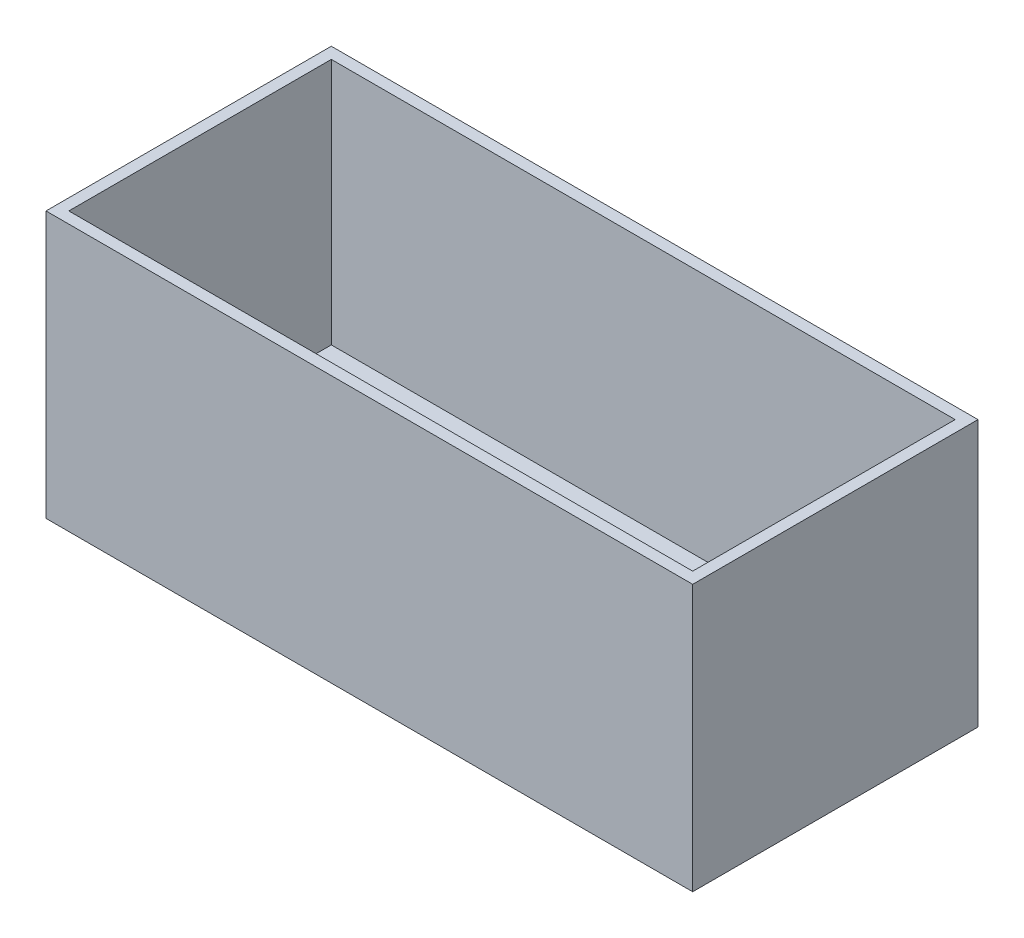
ISO-10303-21;
HEADER;
FILE_DESCRIPTION(('STEP AP214'),'2;1');
FILE_NAME('part.step','',(''),(''),'','','');
FILE_SCHEMA(('AUTOMOTIVE_DESIGN { 1 0 10303 214 1 1 1 1 }'));
ENDSEC;
DATA;
#1=APPLICATION_CONTEXT('core data for automotive mechanical design processes');
#2=APPLICATION_PROTOCOL_DEFINITION('international standard','automotive_design',2000,#1);
#3=PRODUCT_CONTEXT('',#1,'mechanical');
#4=PRODUCT('Part','Part','',(#3));
#5=PRODUCT_RELATED_PRODUCT_CATEGORY('part','',(#4));
#6=PRODUCT_DEFINITION_FORMATION('','',#4);
#7=PRODUCT_DEFINITION_CONTEXT('part definition',#1,'design');
#8=PRODUCT_DEFINITION('design','',#6,#7);
#9=PRODUCT_DEFINITION_SHAPE('','',#8);
#10=(LENGTH_UNIT() NAMED_UNIT(*) SI_UNIT(.MILLI.,.METRE.));
#11=(NAMED_UNIT(*) PLANE_ANGLE_UNIT() SI_UNIT($,.RADIAN.));
#12=(NAMED_UNIT(*) SI_UNIT($,.STERADIAN.) SOLID_ANGLE_UNIT());
#13=UNCERTAINTY_MEASURE_WITH_UNIT(LENGTH_MEASURE(1.E-05),#10,'distance_accuracy_value','');
#14=(GEOMETRIC_REPRESENTATION_CONTEXT(3) GLOBAL_UNCERTAINTY_ASSIGNED_CONTEXT((#13)) GLOBAL_UNIT_ASSIGNED_CONTEXT((#10,
#11,#12)) REPRESENTATION_CONTEXT('',''));
#15=CARTESIAN_POINT('',(0.,0.,0.));
#16=DIRECTION('',(0.,0.,1.));
#17=DIRECTION('',(1.,0.,0.));
#18=AXIS2_PLACEMENT_3D('',#15,#16,#17);
#19=CARTESIAN_POINT('',(0.,0.,0.));
#20=DIRECTION('',(0.,1.,0.));
#21=DIRECTION('',(0.,0.,1.));
#22=AXIS2_PLACEMENT_3D('',#19,#20,#21);
#23=PLANE('',#22);
#24=CARTESIAN_POINT('',(67.65,0.,-14.9000000000001));
#25=DIRECTION('',(0.,-1.,0.));
#26=DIRECTION('',(0.,0.,-1.));
#27=AXIS2_PLACEMENT_3D('',#24,#25,#26);
#28=CIRCLE('',#27,2.2);
#29=CARTESIAN_POINT('',(67.65,0.,-17.1000000000001));
#30=VERTEX_POINT('',#29);
#31=EDGE_CURVE('E319',#30,#30,#28,.T.);
#32=ORIENTED_EDGE('',*,*,#31,.F.);
#33=EDGE_LOOP('',(#32));
#34=FACE_BOUND('',#33,.T.);
#35=CARTESIAN_POINT('',(67.65,0.,27.9));
#36=DIRECTION('',(0.,1.,0.));
#37=DIRECTION('',(0.,0.,1.));
#38=AXIS2_PLACEMENT_3D('',#35,#36,#37);
#39=CIRCLE('',#38,2.2);
#40=CARTESIAN_POINT('',(67.65,0.,30.1));
#41=VERTEX_POINT('',#40);
#42=EDGE_CURVE('E320',#41,#41,#39,.T.);
#43=ORIENTED_EDGE('',*,*,#42,.T.);
#44=EDGE_LOOP('',(#43));
#45=FACE_BOUND('',#44,.T.);
#46=CARTESIAN_POINT('',(-67.65,0.,-14.9000000000001));
#47=DIRECTION('',(0.,1.,0.));
#48=DIRECTION('',(0.,0.,1.));
#49=AXIS2_PLACEMENT_3D('',#46,#47,#48);
#50=CIRCLE('',#49,2.2);
#51=CARTESIAN_POINT('',(-67.65,0.,-12.7000000000001));
#52=VERTEX_POINT('',#51);
#53=EDGE_CURVE('E168',#52,#52,#50,.T.);
#54=ORIENTED_EDGE('',*,*,#53,.T.);
#55=EDGE_LOOP('',(#54));
#56=FACE_BOUND('',#55,.T.);
#57=DIRECTION('',(0.,0.,1.));
#58=VECTOR('',#57,1.);
#59=CARTESIAN_POINT('',(-85.,0.,-37.5));
#60=LINE('',#59,#58);
#61=CARTESIAN_POINT('',(-85.,0.,-37.5));
#62=VERTEX_POINT('',#61);
#63=CARTESIAN_POINT('',(-85.,0.,37.5));
#64=VERTEX_POINT('',#63);
#65=EDGE_CURVE('E210',#62,#64,#60,.T.);
#66=ORIENTED_EDGE('',*,*,#65,.F.);
#67=DIRECTION('',(1.,0.,0.));
#68=VECTOR('',#67,1.);
#69=CARTESIAN_POINT('',(-85.,0.,-37.5));
#70=LINE('',#69,#68);
#71=CARTESIAN_POINT('',(85.,0.,-37.5));
#72=VERTEX_POINT('',#71);
#73=EDGE_CURVE('E217',#62,#72,#70,.T.);
#74=ORIENTED_EDGE('',*,*,#73,.T.);
#75=DIRECTION('',(0.,0.,1.));
#76=VECTOR('',#75,1.);
#77=CARTESIAN_POINT('',(85.,0.,-37.5));
#78=LINE('',#77,#76);
#79=CARTESIAN_POINT('',(85.,0.,37.5));
#80=VERTEX_POINT('',#79);
#81=EDGE_CURVE('E212',#72,#80,#78,.T.);
#82=ORIENTED_EDGE('',*,*,#81,.T.);
#83=DIRECTION('',(1.,0.,0.));
#84=VECTOR('',#83,1.);
#85=CARTESIAN_POINT('',(-85.,0.,37.5));
#86=LINE('',#85,#84);
#87=EDGE_CURVE('E209',#64,#80,#86,.T.);
#88=ORIENTED_EDGE('',*,*,#87,.F.);
#89=EDGE_LOOP('',(#66,#74,#82,#88));
#90=FACE_BOUND('',#89,.T.);
#91=CARTESIAN_POINT('',(-67.65,0.,27.8999999999999));
#92=DIRECTION('',(0.,-1.,0.));
#93=DIRECTION('',(0.,0.,-1.));
#94=AXIS2_PLACEMENT_3D('',#91,#92,#93);
#95=CIRCLE('',#94,2.2);
#96=CARTESIAN_POINT('',(-67.65,0.,25.6999999999999));
#97=VERTEX_POINT('',#96);
#98=EDGE_CURVE('E322',#97,#97,#95,.T.);
#99=ORIENTED_EDGE('',*,*,#98,.F.);
#100=EDGE_LOOP('',(#99));
#101=FACE_BOUND('',#100,.T.);
#102=ADVANCED_FACE('F69',(#34,#45,#56,#90,#101),#23,.F.);
#103=CARTESIAN_POINT('',(0.,5.,0.));
#104=DIRECTION('',(0.,1.,0.));
#105=DIRECTION('',(0.,0.,1.));
#106=AXIS2_PLACEMENT_3D('',#103,#104,#105);
#107=PLANE('',#106);
#108=CARTESIAN_POINT('',(67.65,5.,27.9));
#109=DIRECTION('',(0.,1.,0.));
#110=DIRECTION('',(0.,0.,1.));
#111=AXIS2_PLACEMENT_3D('',#108,#109,#110);
#112=CIRCLE('',#111,2.2);
#113=CARTESIAN_POINT('',(67.65,5.,30.1));
#114=VERTEX_POINT('',#113);
#115=EDGE_CURVE('E231',#114,#114,#112,.F.);
#116=ORIENTED_EDGE('',*,*,#115,.T.);
#117=EDGE_LOOP('',(#116));
#118=FACE_BOUND('',#117,.T.);
#119=CARTESIAN_POINT('',(-67.65,5.,-14.9000000000001));
#120=DIRECTION('',(0.,1.,0.));
#121=DIRECTION('',(0.,0.,1.));
#122=AXIS2_PLACEMENT_3D('',#119,#120,#121);
#123=CIRCLE('',#122,2.2);
#124=CARTESIAN_POINT('',(-67.65,5.,-12.7000000000001));
#125=VERTEX_POINT('',#124);
#126=EDGE_CURVE('E226',#125,#125,#123,.F.);
#127=ORIENTED_EDGE('',*,*,#126,.T.);
#128=EDGE_LOOP('',(#127));
#129=FACE_BOUND('',#128,.T.);
#130=DIRECTION('',(0.,0.,-1.));
#131=VECTOR('',#130,1.);
#132=CARTESIAN_POINT('',(82.,5.,0.));
#133=LINE('',#132,#131);
#134=CARTESIAN_POINT('',(82.,5.,34.5));
#135=VERTEX_POINT('',#134);
#136=CARTESIAN_POINT('',(82.,5.,-34.5));
#137=VERTEX_POINT('',#136);
#138=EDGE_CURVE('E170',#135,#137,#133,.T.);
#139=ORIENTED_EDGE('',*,*,#138,.T.);
#140=DIRECTION('',(-1.,0.,0.));
#141=VECTOR('',#140,1.);
#142=CARTESIAN_POINT('',(0.,5.,-34.5));
#143=LINE('',#142,#141);
#144=CARTESIAN_POINT('',(-82.,5.,-34.5));
#145=VERTEX_POINT('',#144);
#146=EDGE_CURVE('E87',#137,#145,#143,.T.);
#147=ORIENTED_EDGE('',*,*,#146,.T.);
#148=DIRECTION('',(0.,0.,-1.));
#149=VECTOR('',#148,1.);
#150=CARTESIAN_POINT('',(-82.,5.,0.));
#151=LINE('',#150,#149);
#152=CARTESIAN_POINT('',(-82.,5.,34.5));
#153=VERTEX_POINT('',#152);
#154=EDGE_CURVE('E154',#153,#145,#151,.T.);
#155=ORIENTED_EDGE('',*,*,#154,.F.);
#156=DIRECTION('',(-1.,0.,0.));
#157=VECTOR('',#156,1.);
#158=CARTESIAN_POINT('',(0.,5.,34.5));
#159=LINE('',#158,#157);
#160=EDGE_CURVE('E162',#135,#153,#159,.T.);
#161=ORIENTED_EDGE('',*,*,#160,.F.);
#162=EDGE_LOOP('',(#139,#147,#155,#161));
#163=FACE_BOUND('',#162,.T.);
#164=CARTESIAN_POINT('',(67.65,5.,-14.9000000000001));
#165=DIRECTION('',(0.,1.,0.));
#166=DIRECTION('',(0.,0.,1.));
#167=AXIS2_PLACEMENT_3D('',#164,#165,#166);
#168=CIRCLE('',#167,2.2);
#169=CARTESIAN_POINT('',(67.65,5.,-12.7000000000001));
#170=VERTEX_POINT('',#169);
#171=EDGE_CURVE('E237',#170,#170,#168,.T.);
#172=ORIENTED_EDGE('',*,*,#171,.F.);
#173=EDGE_LOOP('',(#172));
#174=FACE_BOUND('',#173,.T.);
#175=CARTESIAN_POINT('',(-67.65,5.,27.8999999999999));
#176=DIRECTION('',(0.,1.,0.));
#177=DIRECTION('',(0.,0.,1.));
#178=AXIS2_PLACEMENT_3D('',#175,#176,#177);
#179=CIRCLE('',#178,2.2);
#180=CARTESIAN_POINT('',(-67.65,5.,30.0999999999999));
#181=VERTEX_POINT('',#180);
#182=EDGE_CURVE('E71',#181,#181,#179,.T.);
#183=ORIENTED_EDGE('',*,*,#182,.F.);
#184=EDGE_LOOP('',(#183));
#185=FACE_BOUND('',#184,.T.);
#186=ADVANCED_FACE('F246',(#118,#129,#163,#174,#185),#107,.T.);
#187=CARTESIAN_POINT('',(-85.,5.,-37.5));
#188=DIRECTION('',(1.,0.,0.));
#189=DIRECTION('',(0.,0.,-1.));
#190=AXIS2_PLACEMENT_3D('',#187,#188,#189);
#191=PLANE('',#190);
#192=ORIENTED_EDGE('',*,*,#65,.T.);
#193=DIRECTION('',(0.,-1.,0.));
#194=VECTOR('',#193,1.);
#195=CARTESIAN_POINT('',(-85.,5.,37.5));
#196=LINE('',#195,#194);
#197=CARTESIAN_POINT('',(-85.,70.,37.5));
#198=VERTEX_POINT('',#197);
#199=EDGE_CURVE('E12',#198,#64,#196,.T.);
#200=ORIENTED_EDGE('',*,*,#199,.F.);
#201=DIRECTION('',(0.,0.,-1.));
#202=VECTOR('',#201,1.);
#203=CARTESIAN_POINT('',(-85.,70.,0.));
#204=LINE('',#203,#202);
#205=CARTESIAN_POINT('',(-85.,70.,-37.5));
#206=VERTEX_POINT('',#205);
#207=EDGE_CURVE('E189',#198,#206,#204,.T.);
#208=ORIENTED_EDGE('',*,*,#207,.T.);
#209=DIRECTION('',(0.,-1.,0.));
#210=VECTOR('',#209,1.);
#211=CARTESIAN_POINT('',(-85.,5.,-37.5));
#212=LINE('',#211,#210);
#213=EDGE_CURVE('E92',#206,#62,#212,.T.);
#214=ORIENTED_EDGE('',*,*,#213,.T.);
#215=EDGE_LOOP('',(#192,#200,#208,#214));
#216=FACE_BOUND('',#215,.T.);
#217=ADVANCED_FACE('F72',(#216),#191,.F.);
#218=CARTESIAN_POINT('',(-85.,5.,37.5));
#219=DIRECTION('',(0.,0.,-1.));
#220=DIRECTION('',(-1.,0.,0.));
#221=AXIS2_PLACEMENT_3D('',#218,#219,#220);
#222=PLANE('',#221);
#223=ORIENTED_EDGE('',*,*,#87,.T.);
#224=DIRECTION('',(0.,-1.,0.));
#225=VECTOR('',#224,1.);
#226=CARTESIAN_POINT('',(85.,5.,37.5));
#227=LINE('',#226,#225);
#228=CARTESIAN_POINT('',(85.,70.,37.5));
#229=VERTEX_POINT('',#228);
#230=EDGE_CURVE('E76',#229,#80,#227,.T.);
#231=ORIENTED_EDGE('',*,*,#230,.F.);
#232=DIRECTION('',(-1.,0.,0.));
#233=VECTOR('',#232,1.);
#234=CARTESIAN_POINT('',(0.,70.,37.5));
#235=LINE('',#234,#233);
#236=EDGE_CURVE('E201',#229,#198,#235,.T.);
#237=ORIENTED_EDGE('',*,*,#236,.T.);
#238=ORIENTED_EDGE('',*,*,#199,.T.);
#239=EDGE_LOOP('',(#223,#231,#237,#238));
#240=FACE_BOUND('',#239,.T.);
#241=ADVANCED_FACE('F260',(#240),#222,.F.);
#242=CARTESIAN_POINT('',(85.,5.,-37.5));
#243=DIRECTION('',(1.,0.,0.));
#244=DIRECTION('',(0.,0.,-1.));
#245=AXIS2_PLACEMENT_3D('',#242,#243,#244);
#246=PLANE('',#245);
#247=ORIENTED_EDGE('',*,*,#81,.F.);
#248=DIRECTION('',(0.,-1.,0.));
#249=VECTOR('',#248,1.);
#250=CARTESIAN_POINT('',(85.,5.,-37.5));
#251=LINE('',#250,#249);
#252=CARTESIAN_POINT('',(85.,70.,-37.5));
#253=VERTEX_POINT('',#252);
#254=EDGE_CURVE('E221',#253,#72,#251,.T.);
#255=ORIENTED_EDGE('',*,*,#254,.F.);
#256=DIRECTION('',(0.,0.,-1.));
#257=VECTOR('',#256,1.);
#258=CARTESIAN_POINT('',(85.,70.,0.));
#259=LINE('',#258,#257);
#260=EDGE_CURVE('E200',#229,#253,#259,.T.);
#261=ORIENTED_EDGE('',*,*,#260,.F.);
#262=ORIENTED_EDGE('',*,*,#230,.T.);
#263=EDGE_LOOP('',(#247,#255,#261,#262));
#264=FACE_BOUND('',#263,.T.);
#265=ADVANCED_FACE('F270',(#264),#246,.T.);
#266=CARTESIAN_POINT('',(-85.,5.,-37.5));
#267=DIRECTION('',(0.,0.,-1.));
#268=DIRECTION('',(-1.,0.,0.));
#269=AXIS2_PLACEMENT_3D('',#266,#267,#268);
#270=PLANE('',#269);
#271=ORIENTED_EDGE('',*,*,#73,.F.);
#272=ORIENTED_EDGE('',*,*,#213,.F.);
#273=DIRECTION('',(-1.,0.,0.));
#274=VECTOR('',#273,1.);
#275=CARTESIAN_POINT('',(0.,70.,-37.5));
#276=LINE('',#275,#274);
#277=EDGE_CURVE('E192',#253,#206,#276,.T.);
#278=ORIENTED_EDGE('',*,*,#277,.F.);
#279=ORIENTED_EDGE('',*,*,#254,.T.);
#280=EDGE_LOOP('',(#271,#272,#278,#279));
#281=FACE_BOUND('',#280,.T.);
#282=ADVANCED_FACE('F262',(#281),#270,.T.);
#283=CARTESIAN_POINT('',(0.,70.,0.));
#284=DIRECTION('',(0.,1.,0.));
#285=DIRECTION('',(0.,0.,1.));
#286=AXIS2_PLACEMENT_3D('',#283,#284,#285);
#287=PLANE('',#286);
#288=DIRECTION('',(0.,0.,-1.));
#289=VECTOR('',#288,1.);
#290=CARTESIAN_POINT('',(-82.,70.,0.));
#291=LINE('',#290,#289);
#292=CARTESIAN_POINT('',(-82.,70.,34.5));
#293=VERTEX_POINT('',#292);
#294=CARTESIAN_POINT('',(-82.,70.,-34.5));
#295=VERTEX_POINT('',#294);
#296=EDGE_CURVE('E146',#293,#295,#291,.T.);
#297=ORIENTED_EDGE('',*,*,#296,.T.);
#298=DIRECTION('',(-1.,0.,0.));
#299=VECTOR('',#298,1.);
#300=CARTESIAN_POINT('',(0.,70.,-34.5));
#301=LINE('',#300,#299);
#302=CARTESIAN_POINT('',(82.,70.,-34.5));
#303=VERTEX_POINT('',#302);
#304=EDGE_CURVE('E140',#303,#295,#301,.T.);
#305=ORIENTED_EDGE('',*,*,#304,.F.);
#306=DIRECTION('',(0.,0.,-1.));
#307=VECTOR('',#306,1.);
#308=CARTESIAN_POINT('',(82.,70.,0.));
#309=LINE('',#308,#307);
#310=CARTESIAN_POINT('',(82.,70.,34.5));
#311=VERTEX_POINT('',#310);
#312=EDGE_CURVE('E150',#311,#303,#309,.T.);
#313=ORIENTED_EDGE('',*,*,#312,.F.);
#314=DIRECTION('',(-1.,0.,0.));
#315=VECTOR('',#314,1.);
#316=CARTESIAN_POINT('',(0.,70.,34.5));
#317=LINE('',#316,#315);
#318=EDGE_CURVE('E160',#311,#293,#317,.T.);
#319=ORIENTED_EDGE('',*,*,#318,.T.);
#320=EDGE_LOOP('',(#297,#305,#313,#319));
#321=FACE_BOUND('',#320,.T.);
#322=ORIENTED_EDGE('',*,*,#207,.F.);
#323=ORIENTED_EDGE('',*,*,#236,.F.);
#324=ORIENTED_EDGE('',*,*,#260,.T.);
#325=ORIENTED_EDGE('',*,*,#277,.T.);
#326=EDGE_LOOP('',(#322,#323,#324,#325));
#327=FACE_BOUND('',#326,.T.);
#328=ADVANCED_FACE('F157',(#321,#327),#287,.T.);
#329=CARTESIAN_POINT('',(-82.,70.,0.));
#330=DIRECTION('',(-1.,0.,0.));
#331=DIRECTION('',(0.,0.,1.));
#332=AXIS2_PLACEMENT_3D('',#329,#330,#331);
#333=PLANE('',#332);
#334=ORIENTED_EDGE('',*,*,#154,.T.);
#335=DIRECTION('',(0.,-1.,0.));
#336=VECTOR('',#335,1.);
#337=CARTESIAN_POINT('',(-82.,70.,-34.5));
#338=LINE('',#337,#336);
#339=EDGE_CURVE('E137',#295,#145,#338,.T.);
#340=ORIENTED_EDGE('',*,*,#339,.F.);
#341=ORIENTED_EDGE('',*,*,#296,.F.);
#342=DIRECTION('',(0.,-1.,0.));
#343=VECTOR('',#342,1.);
#344=CARTESIAN_POINT('',(-82.,70.,34.5));
#345=LINE('',#344,#343);
#346=EDGE_CURVE('E184',#293,#153,#345,.T.);
#347=ORIENTED_EDGE('',*,*,#346,.T.);
#348=EDGE_LOOP('',(#334,#340,#341,#347));
#349=FACE_BOUND('',#348,.T.);
#350=ADVANCED_FACE('F155',(#349),#333,.F.);
#351=CARTESIAN_POINT('',(0.,70.,34.5));
#352=DIRECTION('',(0.,0.,1.));
#353=DIRECTION('',(1.,0.,0.));
#354=AXIS2_PLACEMENT_3D('',#351,#352,#353);
#355=PLANE('',#354);
#356=ORIENTED_EDGE('',*,*,#160,.T.);
#357=ORIENTED_EDGE('',*,*,#346,.F.);
#358=ORIENTED_EDGE('',*,*,#318,.F.);
#359=DIRECTION('',(0.,-1.,0.));
#360=VECTOR('',#359,1.);
#361=CARTESIAN_POINT('',(82.,70.,34.5));
#362=LINE('',#361,#360);
#363=EDGE_CURVE('E190',#311,#135,#362,.T.);
#364=ORIENTED_EDGE('',*,*,#363,.T.);
#365=EDGE_LOOP('',(#356,#357,#358,#364));
#366=FACE_BOUND('',#365,.T.);
#367=ADVANCED_FACE('F290',(#366),#355,.F.);
#368=CARTESIAN_POINT('',(82.,70.,0.));
#369=DIRECTION('',(-1.,0.,0.));
#370=DIRECTION('',(0.,0.,1.));
#371=AXIS2_PLACEMENT_3D('',#368,#369,#370);
#372=PLANE('',#371);
#373=ORIENTED_EDGE('',*,*,#138,.F.);
#374=ORIENTED_EDGE('',*,*,#363,.F.);
#375=ORIENTED_EDGE('',*,*,#312,.T.);
#376=DIRECTION('',(0.,-1.,0.));
#377=VECTOR('',#376,1.);
#378=CARTESIAN_POINT('',(82.,70.,-34.5));
#379=LINE('',#378,#377);
#380=EDGE_CURVE('E143',#303,#137,#379,.T.);
#381=ORIENTED_EDGE('',*,*,#380,.T.);
#382=EDGE_LOOP('',(#373,#374,#375,#381));
#383=FACE_BOUND('',#382,.T.);
#384=ADVANCED_FACE('F292',(#383),#372,.T.);
#385=CARTESIAN_POINT('',(0.,70.,-34.5));
#386=DIRECTION('',(0.,0.,1.));
#387=DIRECTION('',(1.,0.,0.));
#388=AXIS2_PLACEMENT_3D('',#385,#386,#387);
#389=PLANE('',#388);
#390=ORIENTED_EDGE('',*,*,#146,.F.);
#391=ORIENTED_EDGE('',*,*,#380,.F.);
#392=ORIENTED_EDGE('',*,*,#304,.T.);
#393=ORIENTED_EDGE('',*,*,#339,.T.);
#394=EDGE_LOOP('',(#390,#391,#392,#393));
#395=FACE_BOUND('',#394,.T.);
#396=ADVANCED_FACE('F139',(#395),#389,.T.);
#397=CARTESIAN_POINT('',(-67.65,6.,-14.9000000000001));
#398=DIRECTION('',(0.,-1.,0.));
#399=DIRECTION('',(0.,0.,-1.));
#400=AXIS2_PLACEMENT_3D('',#397,#398,#399);
#401=CYLINDRICAL_SURFACE('',#400,2.2);
#402=ORIENTED_EDGE('',*,*,#126,.F.);
#403=EDGE_LOOP('',(#402));
#404=FACE_BOUND('',#403,.T.);
#405=ORIENTED_EDGE('',*,*,#53,.F.);
#406=EDGE_LOOP('',(#405));
#407=FACE_BOUND('',#406,.T.);
#408=ADVANCED_FACE('F299',(#404,#407),#401,.F.);
#409=CARTESIAN_POINT('',(67.65,6.,27.9));
#410=DIRECTION('',(0.,-1.,0.));
#411=DIRECTION('',(0.,0.,-1.));
#412=AXIS2_PLACEMENT_3D('',#409,#410,#411);
#413=CYLINDRICAL_SURFACE('',#412,2.2);
#414=ORIENTED_EDGE('',*,*,#115,.F.);
#415=EDGE_LOOP('',(#414));
#416=FACE_BOUND('',#415,.T.);
#417=ORIENTED_EDGE('',*,*,#42,.F.);
#418=EDGE_LOOP('',(#417));
#419=FACE_BOUND('',#418,.T.);
#420=ADVANCED_FACE('F305',(#416,#419),#413,.F.);
#421=CARTESIAN_POINT('',(67.65,6.,-14.9000000000001));
#422=DIRECTION('',(0.,-1.,0.));
#423=DIRECTION('',(0.,0.,-1.));
#424=AXIS2_PLACEMENT_3D('',#421,#422,#423);
#425=CYLINDRICAL_SURFACE('',#424,2.2);
#426=ORIENTED_EDGE('',*,*,#171,.T.);
#427=EDGE_LOOP('',(#426));
#428=FACE_BOUND('',#427,.T.);
#429=ORIENTED_EDGE('',*,*,#31,.T.);
#430=EDGE_LOOP('',(#429));
#431=FACE_BOUND('',#430,.T.);
#432=ADVANCED_FACE('F304',(#428,#431),#425,.F.);
#433=CARTESIAN_POINT('',(-67.65,6.,27.8999999999999));
#434=DIRECTION('',(0.,-1.,0.));
#435=DIRECTION('',(0.,0.,-1.));
#436=AXIS2_PLACEMENT_3D('',#433,#434,#435);
#437=CYLINDRICAL_SURFACE('',#436,2.2);
#438=ORIENTED_EDGE('',*,*,#182,.T.);
#439=EDGE_LOOP('',(#438));
#440=FACE_BOUND('',#439,.T.);
#441=ORIENTED_EDGE('',*,*,#98,.T.);
#442=EDGE_LOOP('',(#441));
#443=FACE_BOUND('',#442,.T.);
#444=ADVANCED_FACE('F243',(#440,#443),#437,.F.);
#445=CLOSED_SHELL('',(#102,#186,#217,#241,#265,#282,#328,#350,#367,#384,#396,#408,#420,#432,#444));
#446=MANIFOLD_SOLID_BREP('B2',#445);
#447=ADVANCED_BREP_SHAPE_REPRESENTATION('',(#18,#446),#14);
#448=SHAPE_DEFINITION_REPRESENTATION(#9,#447);
ENDSEC;
END-ISO-10303-21;
